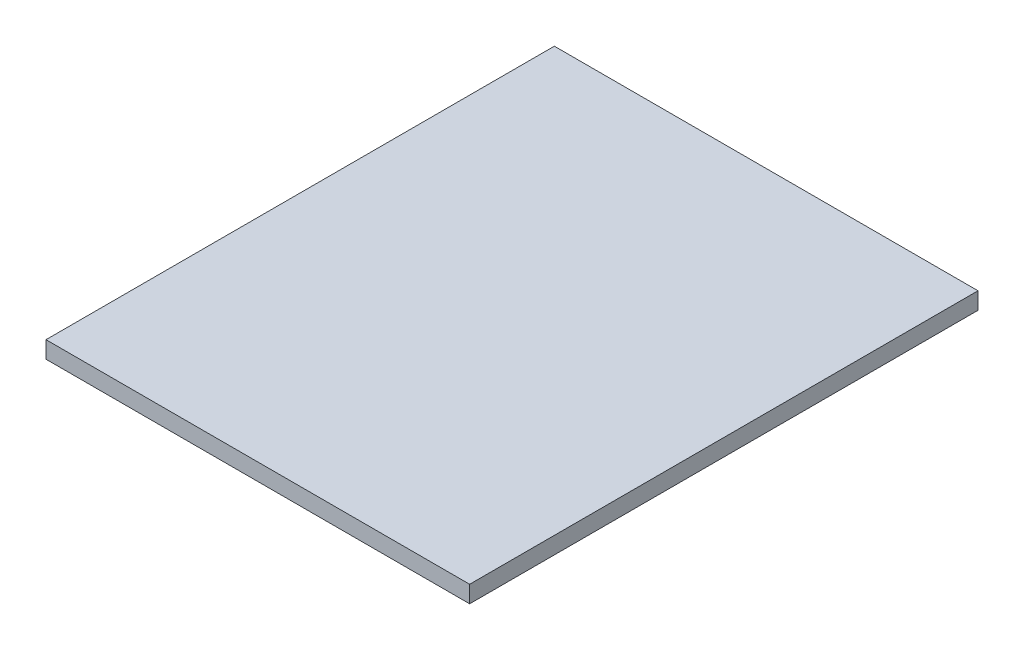
ISO-10303-21;
HEADER;
FILE_DESCRIPTION(('STEP AP214'),'2;1');
FILE_NAME('part.step','',(''),(''),'','','');
FILE_SCHEMA(('AUTOMOTIVE_DESIGN { 1 0 10303 214 1 1 1 1 }'));
ENDSEC;
DATA;
#1=APPLICATION_CONTEXT('core data for automotive mechanical design processes');
#2=APPLICATION_PROTOCOL_DEFINITION('international standard','automotive_design',2000,#1);
#3=PRODUCT_CONTEXT('',#1,'mechanical');
#4=PRODUCT('Part','Part','',(#3));
#5=PRODUCT_RELATED_PRODUCT_CATEGORY('part','',(#4));
#6=PRODUCT_DEFINITION_FORMATION('','',#4);
#7=PRODUCT_DEFINITION_CONTEXT('part definition',#1,'design');
#8=PRODUCT_DEFINITION('design','',#6,#7);
#9=PRODUCT_DEFINITION_SHAPE('','',#8);
#10=(LENGTH_UNIT() NAMED_UNIT(*) SI_UNIT(.MILLI.,.METRE.));
#11=(NAMED_UNIT(*) PLANE_ANGLE_UNIT() SI_UNIT($,.RADIAN.));
#12=(NAMED_UNIT(*) SI_UNIT($,.STERADIAN.) SOLID_ANGLE_UNIT());
#13=UNCERTAINTY_MEASURE_WITH_UNIT(LENGTH_MEASURE(1.E-05),#10,'distance_accuracy_value','');
#14=(GEOMETRIC_REPRESENTATION_CONTEXT(3) GLOBAL_UNCERTAINTY_ASSIGNED_CONTEXT((#13)) GLOBAL_UNIT_ASSIGNED_CONTEXT((#10,
#11,#12)) REPRESENTATION_CONTEXT('',''));
#15=CARTESIAN_POINT('',(0.,0.,0.));
#16=DIRECTION('',(0.,0.,1.));
#17=DIRECTION('',(1.,0.,0.));
#18=AXIS2_PLACEMENT_3D('',#15,#16,#17);
#19=CARTESIAN_POINT('',(125.,10.,150.));
#20=DIRECTION('',(-1.,0.,0.));
#21=DIRECTION('',(0.,0.,1.));
#22=AXIS2_PLACEMENT_3D('',#19,#20,#21);
#23=PLANE('',#22);
#24=DIRECTION('',(0.,0.,-1.));
#25=VECTOR('',#24,1.);
#26=CARTESIAN_POINT('',(125.,0.,150.));
#27=LINE('',#26,#25);
#28=CARTESIAN_POINT('',(125.,0.,150.));
#29=VERTEX_POINT('',#28);
#30=CARTESIAN_POINT('',(125.,0.,-150.));
#31=VERTEX_POINT('',#30);
#32=EDGE_CURVE('E107',#29,#31,#27,.T.);
#33=ORIENTED_EDGE('',*,*,#32,.T.);
#34=DIRECTION('',(0.,-1.,0.));
#35=VECTOR('',#34,1.);
#36=CARTESIAN_POINT('',(125.,10.,-150.));
#37=LINE('',#36,#35);
#38=CARTESIAN_POINT('',(125.,10.,-150.));
#39=VERTEX_POINT('',#38);
#40=EDGE_CURVE('E11',#39,#31,#37,.T.);
#41=ORIENTED_EDGE('',*,*,#40,.F.);
#42=DIRECTION('',(0.,0.,-1.));
#43=VECTOR('',#42,1.);
#44=CARTESIAN_POINT('',(125.,10.,150.));
#45=LINE('',#44,#43);
#46=CARTESIAN_POINT('',(125.,10.,150.));
#47=VERTEX_POINT('',#46);
#48=EDGE_CURVE('E91',#47,#39,#45,.T.);
#49=ORIENTED_EDGE('',*,*,#48,.F.);
#50=DIRECTION('',(0.,-1.,0.));
#51=VECTOR('',#50,1.);
#52=CARTESIAN_POINT('',(125.,10.,150.));
#53=LINE('',#52,#51);
#54=EDGE_CURVE('E103',#47,#29,#53,.T.);
#55=ORIENTED_EDGE('',*,*,#54,.T.);
#56=EDGE_LOOP('',(#33,#41,#49,#55));
#57=FACE_BOUND('',#56,.T.);
#58=ADVANCED_FACE('F39',(#57),#23,.F.);
#59=CARTESIAN_POINT('',(-125.,10.,-150.));
#60=DIRECTION('',(0.,0.,1.));
#61=DIRECTION('',(1.,0.,0.));
#62=AXIS2_PLACEMENT_3D('',#59,#60,#61);
#63=PLANE('',#62);
#64=DIRECTION('',(-1.,0.,0.));
#65=VECTOR('',#64,1.);
#66=CARTESIAN_POINT('',(-125.,0.,-150.));
#67=LINE('',#66,#65);
#68=CARTESIAN_POINT('',(-125.,0.,-150.));
#69=VERTEX_POINT('',#68);
#70=EDGE_CURVE('E96',#31,#69,#67,.T.);
#71=ORIENTED_EDGE('',*,*,#70,.T.);
#72=DIRECTION('',(0.,-1.,0.));
#73=VECTOR('',#72,1.);
#74=CARTESIAN_POINT('',(-125.,10.,-150.));
#75=LINE('',#74,#73);
#76=CARTESIAN_POINT('',(-125.,10.,-150.));
#77=VERTEX_POINT('',#76);
#78=EDGE_CURVE('E48',#77,#69,#75,.T.);
#79=ORIENTED_EDGE('',*,*,#78,.F.);
#80=DIRECTION('',(-1.,0.,0.));
#81=VECTOR('',#80,1.);
#82=CARTESIAN_POINT('',(-125.,10.,-150.));
#83=LINE('',#82,#81);
#84=EDGE_CURVE('E86',#39,#77,#83,.T.);
#85=ORIENTED_EDGE('',*,*,#84,.F.);
#86=ORIENTED_EDGE('',*,*,#40,.T.);
#87=EDGE_LOOP('',(#71,#79,#85,#86));
#88=FACE_BOUND('',#87,.T.);
#89=ADVANCED_FACE('F95',(#88),#63,.F.);
#90=CARTESIAN_POINT('',(-125.,10.,150.));
#91=DIRECTION('',(1.,0.,0.));
#92=DIRECTION('',(0.,0.,-1.));
#93=AXIS2_PLACEMENT_3D('',#90,#91,#92);
#94=PLANE('',#93);
#95=DIRECTION('',(0.,0.,1.));
#96=VECTOR('',#95,1.);
#97=CARTESIAN_POINT('',(-125.,0.,150.));
#98=LINE('',#97,#96);
#99=CARTESIAN_POINT('',(-125.,0.,150.));
#100=VERTEX_POINT('',#99);
#101=EDGE_CURVE('E73',#69,#100,#98,.T.);
#102=ORIENTED_EDGE('',*,*,#101,.T.);
#103=DIRECTION('',(0.,-1.,0.));
#104=VECTOR('',#103,1.);
#105=CARTESIAN_POINT('',(-125.,10.,150.));
#106=LINE('',#105,#104);
#107=CARTESIAN_POINT('',(-125.,10.,150.));
#108=VERTEX_POINT('',#107);
#109=EDGE_CURVE('E98',#108,#100,#106,.T.);
#110=ORIENTED_EDGE('',*,*,#109,.F.);
#111=DIRECTION('',(0.,0.,1.));
#112=VECTOR('',#111,1.);
#113=CARTESIAN_POINT('',(-125.,10.,150.));
#114=LINE('',#113,#112);
#115=EDGE_CURVE('E89',#77,#108,#114,.T.);
#116=ORIENTED_EDGE('',*,*,#115,.F.);
#117=ORIENTED_EDGE('',*,*,#78,.T.);
#118=EDGE_LOOP('',(#102,#110,#116,#117));
#119=FACE_BOUND('',#118,.T.);
#120=ADVANCED_FACE('F99',(#119),#94,.F.);
#121=CARTESIAN_POINT('',(-125.,10.,150.));
#122=DIRECTION('',(0.,0.,-1.));
#123=DIRECTION('',(-1.,0.,0.));
#124=AXIS2_PLACEMENT_3D('',#121,#122,#123);
#125=PLANE('',#124);
#126=DIRECTION('',(1.,0.,0.));
#127=VECTOR('',#126,1.);
#128=CARTESIAN_POINT('',(-125.,0.,150.));
#129=LINE('',#128,#127);
#130=EDGE_CURVE('E79',#100,#29,#129,.T.);
#131=ORIENTED_EDGE('',*,*,#130,.T.);
#132=ORIENTED_EDGE('',*,*,#54,.F.);
#133=DIRECTION('',(1.,0.,0.));
#134=VECTOR('',#133,1.);
#135=CARTESIAN_POINT('',(-125.,10.,150.));
#136=LINE('',#135,#134);
#137=EDGE_CURVE('E56',#108,#47,#136,.T.);
#138=ORIENTED_EDGE('',*,*,#137,.F.);
#139=ORIENTED_EDGE('',*,*,#109,.T.);
#140=EDGE_LOOP('',(#131,#132,#138,#139));
#141=FACE_BOUND('',#140,.T.);
#142=ADVANCED_FACE('F120',(#141),#125,.F.);
#143=CARTESIAN_POINT('',(0.,10.,0.));
#144=DIRECTION('',(0.,-1.,0.));
#145=DIRECTION('',(0.,0.,-1.));
#146=AXIS2_PLACEMENT_3D('',#143,#144,#145);
#147=PLANE('',#146);
#148=ORIENTED_EDGE('',*,*,#48,.T.);
#149=ORIENTED_EDGE('',*,*,#84,.T.);
#150=ORIENTED_EDGE('',*,*,#115,.T.);
#151=ORIENTED_EDGE('',*,*,#137,.T.);
#152=EDGE_LOOP('',(#148,#149,#150,#151));
#153=FACE_BOUND('',#152,.T.);
#154=ADVANCED_FACE('F87',(#153),#147,.F.);
#155=CARTESIAN_POINT('',(0.,0.,0.));
#156=DIRECTION('',(0.,-1.,0.));
#157=DIRECTION('',(0.,0.,-1.));
#158=AXIS2_PLACEMENT_3D('',#155,#156,#157);
#159=PLANE('',#158);
#160=ORIENTED_EDGE('',*,*,#32,.F.);
#161=ORIENTED_EDGE('',*,*,#130,.F.);
#162=ORIENTED_EDGE('',*,*,#101,.F.);
#163=ORIENTED_EDGE('',*,*,#70,.F.);
#164=EDGE_LOOP('',(#160,#161,#162,#163));
#165=FACE_BOUND('',#164,.T.);
#166=ADVANCED_FACE('F123',(#165),#159,.T.);
#167=CLOSED_SHELL('',(#58,#89,#120,#142,#154,#166));
#168=MANIFOLD_SOLID_BREP('B2',#167);
#169=ADVANCED_BREP_SHAPE_REPRESENTATION('',(#18,#168),#14);
#170=SHAPE_DEFINITION_REPRESENTATION(#9,#169);
ENDSEC;
END-ISO-10303-21;
